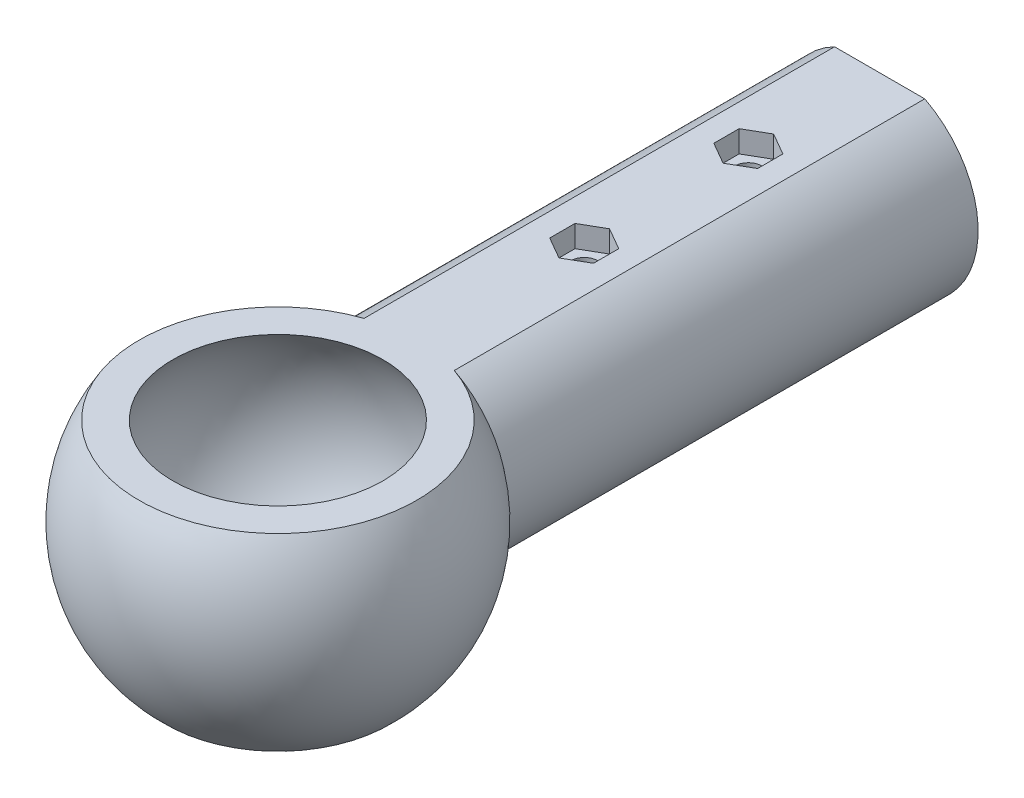
ISO-10303-21;
HEADER;
FILE_DESCRIPTION(('STEP AP214'),'2;1');
FILE_NAME('part.step','',(''),(''),'','','');
FILE_SCHEMA(('AUTOMOTIVE_DESIGN { 1 0 10303 214 1 1 1 1 }'));
ENDSEC;
DATA;
#1=APPLICATION_CONTEXT('core data for automotive mechanical design processes');
#2=APPLICATION_PROTOCOL_DEFINITION('international standard','automotive_design',2000,#1);
#3=PRODUCT_CONTEXT('',#1,'mechanical');
#4=PRODUCT('Part','Part','',(#3));
#5=PRODUCT_RELATED_PRODUCT_CATEGORY('part','',(#4));
#6=PRODUCT_DEFINITION_FORMATION('','',#4);
#7=PRODUCT_DEFINITION_CONTEXT('part definition',#1,'design');
#8=PRODUCT_DEFINITION('design','',#6,#7);
#9=PRODUCT_DEFINITION_SHAPE('','',#8);
#10=(LENGTH_UNIT() NAMED_UNIT(*) SI_UNIT(.MILLI.,.METRE.));
#11=(NAMED_UNIT(*) PLANE_ANGLE_UNIT() SI_UNIT($,.RADIAN.));
#12=(NAMED_UNIT(*) SI_UNIT($,.STERADIAN.) SOLID_ANGLE_UNIT());
#13=UNCERTAINTY_MEASURE_WITH_UNIT(LENGTH_MEASURE(1.E-05),#10,'distance_accuracy_value','');
#14=(GEOMETRIC_REPRESENTATION_CONTEXT(3) GLOBAL_UNCERTAINTY_ASSIGNED_CONTEXT((#13)) GLOBAL_UNIT_ASSIGNED_CONTEXT((#10,
#11,#12)) REPRESENTATION_CONTEXT('',''));
#15=CARTESIAN_POINT('',(0.,0.,0.));
#16=DIRECTION('',(0.,0.,1.));
#17=DIRECTION('',(1.,0.,0.));
#18=AXIS2_PLACEMENT_3D('',#15,#16,#17);
#19=CARTESIAN_POINT('',(0.,0.,0.));
#20=DIRECTION('',(0.,1.,0.));
#21=DIRECTION('',(1.,0.,0.));
#22=AXIS2_PLACEMENT_3D('',#19,#20,#21);
#23=SPHERICAL_SURFACE('',#22,12.5);
#24=CARTESIAN_POINT('',(0.,8.,0.));
#25=DIRECTION('',(0.,1.,0.));
#26=DIRECTION('',(-1.,0.,0.));
#27=AXIS2_PLACEMENT_3D('',#24,#25,#26);
#28=CIRCLE('',#27,9.60468635614927);
#29=CARTESIAN_POINT('',(9.60468635614927,8.,0.));
#30=VERTEX_POINT('',#29);
#31=EDGE_CURVE('E260',#30,#30,#28,.T.);
#32=CARTESIAN_POINT('',(0.,-11.,0.));
#33=DIRECTION('',(0.,1.,0.));
#34=DIRECTION('',(-1.,0.,0.));
#35=AXIS2_PLACEMENT_3D('',#32,#33,#34);
#36=CIRCLE('',#35,5.93717104351896);
#37=CARTESIAN_POINT('',(5.93717104351896,-11.,0.));
#38=VERTEX_POINT('',#37);
#39=EDGE_CURVE('E11',#38,#38,#36,.T.);
#40=CARTESIAN_POINT('',(9.60468635614927,8.,0.));
#41=CARTESIAN_POINT('',(9.75222201246012,7.82288172128415,0.));
#42=CARTESIAN_POINT('',(9.89484713503428,7.6416742013728,0.));
#43=CARTESIAN_POINT('',(10.1698645834093,7.27165351767617,0.));
#44=CARTESIAN_POINT('',(10.3022569092101,7.0828403538909,0.));
#45=CARTESIAN_POINT('',(10.5563970347384,6.69818122096353,0.));
#46=CARTESIAN_POINT('',(10.6781448344659,6.50233525182143,0.));
#47=CARTESIAN_POINT('',(10.910625140093,6.10421110257657,0.));
#48=CARTESIAN_POINT('',(11.0213576459926,5.90193292247381,0.));
#49=CARTESIAN_POINT('',(11.2314680542484,5.49156295696072,0.));
#50=CARTESIAN_POINT('',(11.3308459566047,5.28347117155039,0.));
#51=CARTESIAN_POINT('',(11.5179431948164,4.86211083806857,0.));
#52=CARTESIAN_POINT('',(11.6056625306718,4.64884228999707,0.));
#53=CARTESIAN_POINT('',(11.7691741860143,4.21778099444775,0.));
#54=CARTESIAN_POINT('',(11.8449665055014,3.99998824696993,0.));
#55=CARTESIAN_POINT('',(11.9843922174222,3.56054499177883,0.));
#56=CARTESIAN_POINT('',(12.0480256098561,3.33889448406556,0.));
#57=CARTESIAN_POINT('',(12.1629387509646,2.89241394346969,0.));
#58=CARTESIAN_POINT('',(12.2142184996392,2.66758391058711,0.));
#59=CARTESIAN_POINT('',(12.3042674410165,2.21543228617762,0.));
#60=CARTESIAN_POINT('',(12.3430366337192,1.98811069465072,0.));
#61=CARTESIAN_POINT('',(12.4079458316376,1.53167154287503,0.));
#62=CARTESIAN_POINT('',(12.4340858368533,1.30255398262624,0.));
#63=CARTESIAN_POINT('',(12.4736566730409,0.843223979048433,0.));
#64=CARTESIAN_POINT('',(12.4870875040127,0.613011535719417,0.));
#65=CARTESIAN_POINT('',(12.5011988941851,0.152196201853142,0.));
#66=CARTESIAN_POINT('',(12.5018794533858,-0.0784066886841183,0.));
#67=CARTESIAN_POINT('',(12.4904882175501,-0.539297286338623,0.));
#68=CARTESIAN_POINT('',(12.4784164225138,-0.769584993455867,0.));
#69=CARTESIAN_POINT('',(12.4415574171517,-1.2291405580871,0.));
#70=CARTESIAN_POINT('',(12.4167702068259,-1.45840841560109,0.));
#71=CARTESIAN_POINT('',(12.3545562182204,-1.91522273551862,0.));
#72=CARTESIAN_POINT('',(12.3171294399406,-2.14276919792216,0.));
#73=CARTESIAN_POINT('',(12.2297508390607,-2.5954444494747,0.));
#74=CARTESIAN_POINT('',(12.1797990164606,-2.8205732386237,0.));
#75=CARTESIAN_POINT('',(12.0675231764372,-3.26772426345419,0.));
#76=CARTESIAN_POINT('',(12.0051991590138,-3.48974649913568,0.));
#77=CARTESIAN_POINT('',(11.8683696369941,-3.93000504267989,0.));
#78=CARTESIAN_POINT('',(11.7938641323978,-4.14824135054262,0.));
#79=CARTESIAN_POINT('',(11.6328996182825,-4.58026024880499,0.));
#80=CARTESIAN_POINT('',(11.5464406087636,-4.79404283920462,0.));
#81=CARTESIAN_POINT('',(11.3618336440391,-5.21650014099272,0.));
#82=CARTESIAN_POINT('',(11.2636856888334,-5.42517485238118,0.));
#83=CARTESIAN_POINT('',(11.0560011594345,-5.83677786441066,0.));
#84=CARTESIAN_POINT('',(10.9464645852413,-6.03970616505168,0.));
#85=CARTESIAN_POINT('',(10.7163379929995,-6.43919540744912,0.));
#86=CARTESIAN_POINT('',(10.5957479749509,-6.63575634920555,0.));
#87=CARTESIAN_POINT('',(10.3438834931323,-7.02190940965899,0.));
#88=CARTESIAN_POINT('',(10.2126090293623,-7.21150152835601,0.));
#89=CARTESIAN_POINT('',(9.93977734743803,-7.58313680180104,0.));
#90=CARTESIAN_POINT('',(9.79822012928373,-7.76517995654905,0.));
#91=CARTESIAN_POINT('',(9.50525609654527,-8.12116026386845,0.));
#92=CARTESIAN_POINT('',(9.35384928196111,-8.29509741643983,0.));
#93=CARTESIAN_POINT('',(9.04164934592502,-8.63433347273774,0.));
#94=CARTESIAN_POINT('',(8.88085622447309,-8.79963237646427,0.));
#95=CARTESIAN_POINT('',(8.55037571396118,-9.12108616684501,0.));
#96=CARTESIAN_POINT('',(8.3806883249012,-9.27724105349922,0.));
#97=CARTESIAN_POINT('',(8.03293842918388,-9.57992885021599,0.));
#98=CARTESIAN_POINT('',(7.85487592252655,-9.72646176027855,0.));
#99=CARTESIAN_POINT('',(7.49092096142917,-10.0094577266968,0.));
#100=CARTESIAN_POINT('',(7.30502850698913,-10.1459207830526,0.));
#101=CARTESIAN_POINT('',(6.92598131461576,-10.4083575904974,0.));
#102=CARTESIAN_POINT('',(6.73282657668245,-10.5343313415866,0.));
#103=CARTESIAN_POINT('',(6.3398501700216,-10.7754110941207,0.));
#104=CARTESIAN_POINT('',(6.14002850129407,-10.8905170955658,0.));
#105=CARTESIAN_POINT('',(5.93717104351896,-11.,0.));
#106=B_SPLINE_CURVE_WITH_KNOTS('',3,(#40,#41,#42,#43,#44,#45,#46,#47,#48,#49,#50,#51,#52,#53,
#54,#55,#56,#57,#58,#59,#60,#61,#62,#63,#64,#65,#66,#67,#68,#69,#70,#71,#72,#73,#74,#75,#76,#77,
#78,#79,#80,#81,#82,#83,#84,#85,#86,#87,#88,#89,#90,#91,#92,#93,#94,#95,#96,#97,#98,#99,#100,
#101,#102,#103,#104,#105),.UNSPECIFIED.,.F.,.F.,(4,2,2,2,2,2,2,2,2,2,2,2,2,2,2,2,2,2,2,2,2,2,2,
2,2,2,2,2,2,2,2,2,4),(0.,0.691458867471599,1.3829177349432,2.0743766024148,2.7658354698864,
3.457294337358,4.1487532048296,4.84021207230119,5.53167093977279,6.22312980724439,
6.91458867471599,7.60604754218759,8.29750640965919,8.98896527713079,9.68042414460239,
10.371883012074,11.0633418795456,11.7548007470172,12.4462596144888,13.1377184819604,
13.829177349432,14.5206362169036,15.2120950843752,15.9035539518468,16.5950128193184,
17.28647168679,17.9779305542616,18.6693894217332,19.3608482892048,20.0523071566764,
20.743766024148,21.4352248916196,22.1266837590912),.UNSPECIFIED.);
#107=EDGE_CURVE('BSEAM38',#30,#38,#106,.T.);
#108=ORIENTED_EDGE('',*,*,#31,.T.);
#109=ORIENTED_EDGE('',*,*,#39,.F.);
#110=ORIENTED_EDGE('',*,*,#107,.T.);
#111=ORIENTED_EDGE('',*,*,#107,.F.);
#112=EDGE_LOOP('',(#108,#110,#109,#111));
#113=FACE_BOUND('',#112,.T.);
#114=ADVANCED_FACE('F38',(#113),#23,.F.);
#115=CARTESIAN_POINT('',(0.,-11.,0.));
#116=DIRECTION('',(0.,1.,0.));
#117=DIRECTION('',(-1.,0.,0.));
#118=AXIS2_PLACEMENT_3D('',#115,#116,#117);
#119=PLANE('',#118);
#120=CARTESIAN_POINT('',(0.,-11.,0.));
#121=DIRECTION('',(0.,1.,0.));
#122=DIRECTION('',(-1.,0.,0.));
#123=AXIS2_PLACEMENT_3D('',#120,#121,#122);
#124=CIRCLE('',#123,10.1980390271856);
#125=CARTESIAN_POINT('',(-10.1980390271856,-11.,0.));
#126=VERTEX_POINT('',#125);
#127=EDGE_CURVE('E45',#126,#126,#124,.T.);
#128=ORIENTED_EDGE('',*,*,#127,.F.);
#129=EDGE_LOOP('',(#128));
#130=FACE_BOUND('',#129,.T.);
#131=ORIENTED_EDGE('',*,*,#39,.T.);
#132=EDGE_LOOP('',(#131));
#133=FACE_BOUND('',#132,.T.);
#134=ADVANCED_FACE('F271',(#130,#133),#119,.F.);
#135=CARTESIAN_POINT('',(0.,0.,0.));
#136=DIRECTION('',(0.,1.,0.));
#137=DIRECTION('',(1.,0.,0.));
#138=AXIS2_PLACEMENT_3D('',#135,#136,#137);
#139=SPHERICAL_SURFACE('',#138,15.);
#140=CARTESIAN_POINT('',(0.,8.,0.));
#141=DIRECTION('',(0.,1.,0.));
#142=DIRECTION('',(-1.,0.,0.));
#143=AXIS2_PLACEMENT_3D('',#140,#141,#142);
#144=CIRCLE('',#143,12.6885775404495);
#145=CARTESIAN_POINT('',(-4.12310562561766,8.,-12.));
#146=VERTEX_POINT('',#145);
#147=CARTESIAN_POINT('',(4.12310562561766,8.,-12.));
#148=VERTEX_POINT('',#147);
#149=EDGE_CURVE('E264',#146,#148,#144,.T.);
#150=ORIENTED_EDGE('',*,*,#149,.F.);
#151=CARTESIAN_POINT('',(0.,0.,-12.));
#152=DIRECTION('',(0.,0.,1.));
#153=DIRECTION('',(1.,0.,0.));
#154=AXIS2_PLACEMENT_3D('',#151,#152,#153);
#155=CIRCLE('',#154,9.);
#156=EDGE_CURVE('E254',#148,#146,#155,.F.);
#157=ORIENTED_EDGE('',*,*,#156,.F.);
#158=EDGE_LOOP('',(#150,#157));
#159=FACE_BOUND('',#158,.T.);
#160=ORIENTED_EDGE('',*,*,#127,.T.);
#161=EDGE_LOOP('',(#160));
#162=FACE_BOUND('',#161,.T.);
#163=ADVANCED_FACE('F269',(#159,#162),#139,.T.);
#164=CARTESIAN_POINT('',(0.,8.,0.));
#165=DIRECTION('',(0.,1.,0.));
#166=DIRECTION('',(-1.,0.,0.));
#167=AXIS2_PLACEMENT_3D('',#164,#165,#166);
#168=PLANE('',#167);
#169=DIRECTION('',(0.866025403784438,0.,0.500000000000002));
#170=VECTOR('',#169,1.);
#171=CARTESIAN_POINT('',(11.1243556529822,8.,-19.2679491924311));
#172=LINE('',#171,#170);
#173=CARTESIAN_POINT('',(-2.,8.,-26.8452994616208));
#174=VERTEX_POINT('',#173);
#175=CARTESIAN_POINT('',(0.,8.,-25.6905989232415));
#176=VERTEX_POINT('',#175);
#177=EDGE_CURVE('E52',#174,#176,#172,.T.);
#178=ORIENTED_EDGE('',*,*,#177,.F.);
#179=DIRECTION('',(0.,0.,1.));
#180=VECTOR('',#179,1.);
#181=CARTESIAN_POINT('',(-2.00000000000003,8.,0.));
#182=LINE('',#181,#180);
#183=CARTESIAN_POINT('',(-2.,8.,-29.1547005383792));
#184=VERTEX_POINT('',#183);
#185=EDGE_CURVE('E159',#184,#174,#182,.T.);
#186=ORIENTED_EDGE('',*,*,#185,.F.);
#187=DIRECTION('',(-0.866025403784439,0.,0.499999999999999));
#188=VECTOR('',#187,1.);
#189=CARTESIAN_POINT('',(-13.1243556529821,8.,-22.7320508075689));
#190=LINE('',#189,#188);
#191=CARTESIAN_POINT('',(0.,8.,-30.3094010767585));
#192=VERTEX_POINT('',#191);
#193=EDGE_CURVE('E162',#192,#184,#190,.T.);
#194=ORIENTED_EDGE('',*,*,#193,.F.);
#195=DIRECTION('',(-0.866025403784438,0.,-0.500000000000001));
#196=VECTOR('',#195,1.);
#197=CARTESIAN_POINT('',(13.1243556529822,8.,-22.7320508075688));
#198=LINE('',#197,#196);
#199=CARTESIAN_POINT('',(2.,8.,-29.1547005383792));
#200=VERTEX_POINT('',#199);
#201=EDGE_CURVE('E182',#200,#192,#198,.T.);
#202=ORIENTED_EDGE('',*,*,#201,.F.);
#203=DIRECTION('',(0.,0.,-1.));
#204=VECTOR('',#203,1.);
#205=CARTESIAN_POINT('',(1.99999999999997,8.,0.));
#206=LINE('',#205,#204);
#207=CARTESIAN_POINT('',(2.,8.,-26.8452994616207));
#208=VERTEX_POINT('',#207);
#209=EDGE_CURVE('E179',#208,#200,#206,.T.);
#210=ORIENTED_EDGE('',*,*,#209,.F.);
#211=DIRECTION('',(0.866025403784439,0.,-0.499999999999999));
#212=VECTOR('',#211,1.);
#213=CARTESIAN_POINT('',(-11.1243556529821,8.,-19.2679491924311));
#214=LINE('',#213,#212);
#215=EDGE_CURVE('E176',#176,#208,#214,.T.);
#216=ORIENTED_EDGE('',*,*,#215,.F.);
#217=EDGE_LOOP('',(#178,#186,#194,#202,#210,#216));
#218=FACE_BOUND('',#217,.T.);
#219=DIRECTION('',(0.866025403784437,0.,0.500000000000004));
#220=VECTOR('',#219,1.);
#221=CARTESIAN_POINT('',(17.6195461813655,8.,-30.517949192431));
#222=LINE('',#221,#220);
#223=CARTESIAN_POINT('',(-2.00000000000001,8.,-41.8452994616207));
#224=VERTEX_POINT('',#223);
#225=CARTESIAN_POINT('',(0.,8.,-40.6905989232415));
#226=VERTEX_POINT('',#225);
#227=EDGE_CURVE('E60',#224,#226,#222,.T.);
#228=ORIENTED_EDGE('',*,*,#227,.F.);
#229=DIRECTION('',(0.,0.,1.));
#230=VECTOR('',#229,1.);
#231=CARTESIAN_POINT('',(-2.00000000000016,8.,0.));
#232=LINE('',#231,#230);
#233=CARTESIAN_POINT('',(-2.00000000000001,8.,-44.1547005383793));
#234=VERTEX_POINT('',#233);
#235=EDGE_CURVE('E201',#234,#224,#232,.T.);
#236=ORIENTED_EDGE('',*,*,#235,.F.);
#237=DIRECTION('',(-0.866025403784442,0.,0.499999999999995));
#238=VECTOR('',#237,1.);
#239=CARTESIAN_POINT('',(-19.6195461813653,8.,-33.9820508075691));
#240=LINE('',#239,#238);
#241=CARTESIAN_POINT('',(0.,8.,-45.3094010767585));
#242=VERTEX_POINT('',#241);
#243=EDGE_CURVE('E228',#242,#234,#240,.T.);
#244=ORIENTED_EDGE('',*,*,#243,.F.);
#245=DIRECTION('',(-0.866025403784438,0.,-0.500000000000001));
#246=VECTOR('',#245,1.);
#247=CARTESIAN_POINT('',(19.6195461813655,8.,-33.9820508075688));
#248=LINE('',#247,#246);
#249=CARTESIAN_POINT('',(1.99999999999999,8.,-44.1547005383792));
#250=VERTEX_POINT('',#249);
#251=EDGE_CURVE('E225',#250,#242,#248,.T.);
#252=ORIENTED_EDGE('',*,*,#251,.F.);
#253=DIRECTION('',(0.,0.,-1.));
#254=VECTOR('',#253,1.);
#255=CARTESIAN_POINT('',(1.99999999999985,8.,0.));
#256=LINE('',#255,#254);
#257=CARTESIAN_POINT('',(1.99999999999999,8.,-41.8452994616207));
#258=VERTEX_POINT('',#257);
#259=EDGE_CURVE('E222',#258,#250,#256,.T.);
#260=ORIENTED_EDGE('',*,*,#259,.F.);
#261=DIRECTION('',(0.86602540378444,0.,-0.499999999999997));
#262=VECTOR('',#261,1.);
#263=CARTESIAN_POINT('',(-17.6195461813654,8.,-30.5179491924313));
#264=LINE('',#263,#262);
#265=EDGE_CURVE('E218',#226,#258,#264,.T.);
#266=ORIENTED_EDGE('',*,*,#265,.F.);
#267=EDGE_LOOP('',(#228,#236,#244,#252,#260,#266));
#268=FACE_BOUND('',#267,.T.);
#269=ORIENTED_EDGE('',*,*,#149,.T.);
#270=DIRECTION('',(0.,0.,-1.));
#271=VECTOR('',#270,1.);
#272=CARTESIAN_POINT('',(4.12310562561766,8.,15.002));
#273=LINE('',#272,#271);
#274=CARTESIAN_POINT('',(4.12310562561766,8.,-55.));
#275=VERTEX_POINT('',#274);
#276=EDGE_CURVE('E257',#148,#275,#273,.T.);
#277=ORIENTED_EDGE('',*,*,#276,.T.);
#278=DIRECTION('',(1.,0.,0.));
#279=VECTOR('',#278,1.);
#280=CARTESIAN_POINT('',(0.,8.,-55.));
#281=LINE('',#280,#279);
#282=CARTESIAN_POINT('',(-4.12310562561766,8.,-55.));
#283=VERTEX_POINT('',#282);
#284=EDGE_CURVE('E246',#283,#275,#281,.T.);
#285=ORIENTED_EDGE('',*,*,#284,.F.);
#286=DIRECTION('',(0.,0.,-1.));
#287=VECTOR('',#286,1.);
#288=CARTESIAN_POINT('',(-4.12310562561766,8.,15.002));
#289=LINE('',#288,#287);
#290=EDGE_CURVE('E258',#146,#283,#289,.T.);
#291=ORIENTED_EDGE('',*,*,#290,.F.);
#292=EDGE_LOOP('',(#269,#277,#285,#291));
#293=FACE_BOUND('',#292,.T.);
#294=ORIENTED_EDGE('',*,*,#31,.F.);
#295=EDGE_LOOP('',(#294));
#296=FACE_BOUND('',#295,.T.);
#297=ADVANCED_FACE('F282',(#218,#268,#293,#296),#168,.T.);
#298=CARTESIAN_POINT('',(0.,0.,15.002));
#299=DIRECTION('',(0.,0.,-1.));
#300=DIRECTION('',(-1.,0.,0.));
#301=AXIS2_PLACEMENT_3D('',#298,#299,#300);
#302=CYLINDRICAL_SURFACE('',#301,9.);
#303=ORIENTED_EDGE('',*,*,#276,.F.);
#304=ORIENTED_EDGE('',*,*,#156,.T.);
#305=ORIENTED_EDGE('',*,*,#290,.T.);
#306=CARTESIAN_POINT('',(0.,0.,-55.));
#307=DIRECTION('',(0.,0.,-1.));
#308=DIRECTION('',(-1.,0.,0.));
#309=AXIS2_PLACEMENT_3D('',#306,#307,#308);
#310=CIRCLE('',#309,9.);
#311=EDGE_CURVE('E251',#275,#283,#310,.T.);
#312=ORIENTED_EDGE('',*,*,#311,.F.);
#313=EDGE_LOOP('',(#303,#304,#305,#312));
#314=FACE_BOUND('',#313,.T.);
#315=ADVANCED_FACE('F284',(#314),#302,.T.);
#316=CARTESIAN_POINT('',(0.,0.,-55.));
#317=DIRECTION('',(0.,0.,-1.));
#318=DIRECTION('',(-1.,0.,0.));
#319=AXIS2_PLACEMENT_3D('',#316,#317,#318);
#320=PLANE('',#319);
#321=CARTESIAN_POINT('',(0.,0.,-55.));
#322=DIRECTION('',(0.,0.,-1.));
#323=DIRECTION('',(-1.,0.,0.));
#324=AXIS2_PLACEMENT_3D('',#321,#322,#323);
#325=CIRCLE('',#324,3.25);
#326=CARTESIAN_POINT('',(-3.25,0.,-55.));
#327=VERTEX_POINT('',#326);
#328=EDGE_CURVE('E189',#327,#327,#325,.T.);
#329=ORIENTED_EDGE('',*,*,#328,.F.);
#330=EDGE_LOOP('',(#329));
#331=FACE_BOUND('',#330,.T.);
#332=ORIENTED_EDGE('',*,*,#284,.T.);
#333=ORIENTED_EDGE('',*,*,#311,.T.);
#334=EDGE_LOOP('',(#332,#333));
#335=FACE_BOUND('',#334,.T.);
#336=ADVANCED_FACE('F291',(#331,#335),#320,.T.);
#337=CARTESIAN_POINT('',(0.,0.,-20.));
#338=DIRECTION('',(0.,0.,-1.));
#339=DIRECTION('',(-1.,0.,0.));
#340=AXIS2_PLACEMENT_3D('',#337,#338,#339);
#341=CYLINDRICAL_SURFACE('',#340,3.25);
#342=CARTESIAN_POINT('',(-1.25,3.,-28.));
#343=CARTESIAN_POINT('',(-1.25000319745537,2.99999693020502,-28.0673619037019));
#344=CARTESIAN_POINT('',(-1.24453685637931,3.00229337273143,-28.134703414101));
#345=CARTESIAN_POINT('',(-1.22292233273156,3.01116197062263,-28.2673477646486));
#346=CARTESIAN_POINT('',(-1.2067748865064,3.01773383124313,-28.3326507450068));
#347=CARTESIAN_POINT('',(-1.1644851118749,3.03430103760264,-28.4592621475164));
#348=CARTESIAN_POINT('',(-1.1383678573194,3.04428778845201,-28.5205801427222));
#349=CARTESIAN_POINT('',(-1.07696928444334,3.0665453255829,-28.6379885216928));
#350=CARTESIAN_POINT('',(-1.04168506808282,3.07881683381849,-28.6940772446437));
#351=CARTESIAN_POINT('',(-0.960976296274042,3.10498062183253,-28.8023709830085));
#352=CARTESIAN_POINT('',(-0.915148937781949,3.11892225061194,-28.8542639572216));
#353=CARTESIAN_POINT('',(-0.815508173640209,3.14644493430797,-28.9498496653749));
#354=CARTESIAN_POINT('',(-0.761692953494643,3.16002590647052,-28.9935405310312));
#355=CARTESIAN_POINT('',(-0.645213952737278,3.18588750336085,-29.0730070697435));
#356=CARTESIAN_POINT('',(-0.582301074228336,3.19810357973386,-29.1084405175847));
#357=CARTESIAN_POINT('',(-0.450853922361868,3.2192627617563,-29.1680899032031));
#358=CARTESIAN_POINT('',(-0.382321718911632,3.22820706600862,-29.1923099498384));
#359=CARTESIAN_POINT('',(-0.244863970836962,3.24146435676523,-29.2277414672968));
#360=CARTESIAN_POINT('',(-0.176095842151855,3.24596818629773,-29.2394908235221));
#361=CARTESIAN_POINT('',(-0.0374262679004803,3.25052381421997,-29.2513741489623));
#362=CARTESIAN_POINT('',(0.032474781784929,3.2505771355938,-29.2515120916558));
#363=CARTESIAN_POINT('',(0.167558378646777,3.24634513674766,-29.2404749553469));
#364=CARTESIAN_POINT('',(0.232797273028927,3.2422852859325,-29.229887791487));
#365=CARTESIAN_POINT('',(0.360490142606252,3.23058193371427,-29.1986941080258));
#366=CARTESIAN_POINT('',(0.422943919236668,3.22293817724281,-29.1780868752871));
#367=CARTESIAN_POINT('',(0.544392795335088,3.20467884617932,-29.1271811489929));
#368=CARTESIAN_POINT('',(0.603323110386444,3.19402100637039,-29.0967438821445));
#369=CARTESIAN_POINT('',(0.715388559935737,3.17080417065107,-29.0271674937718));
#370=CARTESIAN_POINT('',(0.768521766140895,3.15824454544671,-28.9880254898642));
#371=CARTESIAN_POINT('',(0.870936405392396,3.13160338306432,-28.8993517955799));
#372=CARTESIAN_POINT('',(0.919782699079309,3.11747574681477,-28.8493306423069));
#373=CARTESIAN_POINT('',(1.00856291638196,3.08989754555098,-28.741732897635));
#374=CARTESIAN_POINT('',(1.04849435624595,3.07644717003351,-28.6841542077216));
#375=CARTESIAN_POINT('',(1.11920339124959,3.05144704670473,-28.5612731298965));
#376=CARTESIAN_POINT('',(1.14973383655413,3.03995168719358,-28.4958165538704));
#377=CARTESIAN_POINT('',(1.19917065122021,3.02079477808357,-28.3601318766066));
#378=CARTESIAN_POINT('',(1.21808389456943,3.01313096183162,-28.2899066244055));
#379=CARTESIAN_POINT('',(1.24273369497321,3.00304533622891,-28.1509948901989));
#380=CARTESIAN_POINT('',(1.24916509228454,3.0003475638472,-28.0824519404939));
#381=CARTESIAN_POINT('',(1.25068166613256,2.99971628443752,-27.9452281248645));
#382=CARTESIAN_POINT('',(1.24576989591137,3.00178149535642,-27.8765473010237));
#383=CARTESIAN_POINT('',(1.22537063478902,3.01016207538222,-27.7446701945395));
#384=CARTESIAN_POINT('',(1.21043489510388,3.01625547027882,-27.6813727861931));
#385=CARTESIAN_POINT('',(1.17111398546468,3.03173799310363,-27.5582161865435));
#386=CARTESIAN_POINT('',(1.14672681901346,3.04112781732231,-27.498357724745));
#387=CARTESIAN_POINT('',(1.08813611829483,3.06259143766587,-27.3811986491843));
#388=CARTESIAN_POINT('',(1.05358913575224,3.07475506002144,-27.324086745449));
#389=CARTESIAN_POINT('',(0.976019360175656,3.1002501506241,-27.2162251523608));
#390=CARTESIAN_POINT('',(0.932993328547017,3.11358206401908,-27.165477906163));
#391=CARTESIAN_POINT('',(0.83626325958636,3.14099555684997,-27.0682404625906));
#392=CARTESIAN_POINT('',(0.782035458961136,3.15506720238119,-27.0222666382929));
#393=CARTESIAN_POINT('',(0.666292421085889,3.1815207084538,-26.940002674918));
#394=CARTESIAN_POINT('',(0.604777064768513,3.19390254137915,-26.9037126940913));
#395=CARTESIAN_POINT('',(0.476154665885962,3.21558937621932,-26.842049821881));
#396=CARTESIAN_POINT('',(0.409061117020675,3.22490154724727,-26.8166514510455));
#397=CARTESIAN_POINT('',(0.271111383060865,3.23941321779922,-26.7776541843055));
#398=CARTESIAN_POINT('',(0.200257088685054,3.24461476343106,-26.7640494176807));
#399=CARTESIAN_POINT('',(0.0614523625310875,3.25011592293021,-26.7496828754415));
#400=CARTESIAN_POINT('',(-0.0064118458628447,3.25069498408108,-26.7481888657312));
#401=CARTESIAN_POINT('',(-0.141385544694169,3.24762448574428,-26.7561837719125));
#402=CARTESIAN_POINT('',(-0.208495133147152,3.24397548198717,-26.7656712444142));
#403=CARTESIAN_POINT('',(-0.338226792363145,3.23299123990487,-26.7948414710953));
#404=CARTESIAN_POINT('',(-0.400920852452223,3.22575708710739,-26.8142450775223));
#405=CARTESIAN_POINT('',(-0.52216264283521,3.20836420973963,-26.8624131779957));
#406=CARTESIAN_POINT('',(-0.580709585477494,3.19820493145345,-26.8911794444952));
#407=CARTESIAN_POINT('',(-0.694753814378629,3.17542819862808,-26.9586575559447));
#408=CARTESIAN_POINT('',(-0.750012005524315,3.16272388454766,-26.9977436006713));
#409=CARTESIAN_POINT('',(-0.853407182927476,3.13640676260279,-27.0841722227112));
#410=CARTESIAN_POINT('',(-0.901541566866075,3.1227936253684,-27.1315178035313));
#411=CARTESIAN_POINT('',(-0.992113372825141,3.09525091761236,-27.2362796905163));
#412=CARTESIAN_POINT('',(-1.034078782729,3.08134653941818,-27.2941123534207));
#413=CARTESIAN_POINT('',(-1.10772808741657,3.05564485192131,-27.4164446151574));
#414=CARTESIAN_POINT('',(-1.13940985712348,3.04384797835295,-27.4809455883455));
#415=CARTESIAN_POINT('',(-1.19311045220384,3.02322328375289,-27.6194040308052));
#416=CARTESIAN_POINT('',(-1.2143502399674,3.01464387894162,-27.6937048819332));
#417=CARTESIAN_POINT('',(-1.24278782694803,3.00303611439598,-27.8453476859382));
#418=CARTESIAN_POINT('',(-1.24999633021077,3.00000352327062,-27.9226872746645));
#419=CARTESIAN_POINT('',(-1.25,3.,-28.));
#420=B_SPLINE_CURVE_WITH_KNOTS('',3,(#342,#343,#344,#345,#346,#347,#348,#349,#350,#351,#352,
#353,#354,#355,#356,#357,#358,#359,#360,#361,#362,#363,#364,#365,#366,#367,#368,#369,#370,#371,
#372,#373,#374,#375,#376,#377,#378,#379,#380,#381,#382,#383,#384,#385,#386,#387,#388,#389,#390,
#391,#392,#393,#394,#395,#396,#397,#398,#399,#400,#401,#402,#403,#404,#405,#406,#407,#408,#409,
#410,#411,#412,#413,#414,#415,#416,#417,#418,#419),.UNSPECIFIED.,.T.,.F.,(4,2,2,2,2,2,2,2,2,2,2,
2,2,2,2,2,2,2,2,2,2,2,2,2,2,2,2,2,2,2,2,2,2,2,2,2,2,2,4),(0.,0.201797444211816,
0.403580978125017,0.604860339111082,0.806203410075655,1.01713244424793,1.22810946588885,
1.44669414936216,1.66519867467047,1.87383930943269,2.08240854612957,2.28013197925201,
2.4778694865884,2.67853038326393,2.87925782359888,3.09227760525095,3.30535666211038,
3.52363527865721,3.74178461333498,3.94739605770352,4.15295216405936,4.34803207327522,
4.54315321319247,4.74582749170857,4.94857933275212,5.1649768242965,5.3813778519279,
5.59726983969923,5.81305429711433,6.01568680422644,6.21829268064435,6.41548575788379,
6.61271618764294,6.81842036614766,7.02419950366363,7.24153996942644,7.45892531925475,
7.69070953568987,7.92231686149795),.UNSPECIFIED.);
#421=CARTESIAN_POINT('',(-1.25,3.,-28.));
#422=VERTEX_POINT('',#421);
#423=EDGE_CURVE('E219',#422,#422,#420,.T.);
#424=ORIENTED_EDGE('',*,*,#423,.F.);
#425=EDGE_LOOP('',(#424));
#426=FACE_BOUND('',#425,.T.);
#427=CARTESIAN_POINT('',(-1.25,3.,-43.));
#428=CARTESIAN_POINT('',(-1.25000319745537,2.99999693020502,-43.0673619037019));
#429=CARTESIAN_POINT('',(-1.24453685637931,3.00229337273143,-43.134703414101));
#430=CARTESIAN_POINT('',(-1.22292233273156,3.01116197062263,-43.2673477646486));
#431=CARTESIAN_POINT('',(-1.2067748865064,3.01773383124313,-43.3326507450068));
#432=CARTESIAN_POINT('',(-1.1644851118749,3.03430103760264,-43.4592621475163));
#433=CARTESIAN_POINT('',(-1.13836785731941,3.04428778845201,-43.5205801427222));
#434=CARTESIAN_POINT('',(-1.07696928444334,3.0665453255829,-43.6379885216928));
#435=CARTESIAN_POINT('',(-1.04168506808282,3.07881683381849,-43.6940772446437));
#436=CARTESIAN_POINT('',(-0.960976296274045,3.10498062183253,-43.8023709830084));
#437=CARTESIAN_POINT('',(-0.915148937781953,3.11892225061194,-43.8542639572216));
#438=CARTESIAN_POINT('',(-0.815508173640213,3.14644493430797,-43.9498496653749));
#439=CARTESIAN_POINT('',(-0.761692953494646,3.16002590647052,-43.9935405310312));
#440=CARTESIAN_POINT('',(-0.645213952737282,3.18588750336085,-44.0730070697435));
#441=CARTESIAN_POINT('',(-0.582301074228343,3.19810357973386,-44.1084405175847));
#442=CARTESIAN_POINT('',(-0.450853922361876,3.2192627617563,-44.1680899032031));
#443=CARTESIAN_POINT('',(-0.382321718911638,3.22820706600862,-44.1923099498384));
#444=CARTESIAN_POINT('',(-0.244863970836967,3.24146435676523,-44.2277414672968));
#445=CARTESIAN_POINT('',(-0.17609584215186,3.24596818629773,-44.2394908235221));
#446=CARTESIAN_POINT('',(-0.0374262679004836,3.25052381421997,-44.2513741489623));
#447=CARTESIAN_POINT('',(0.0324747817849268,3.2505771355938,-44.2515120916558));
#448=CARTESIAN_POINT('',(0.167558378646775,3.24634513674766,-44.2404749553469));
#449=CARTESIAN_POINT('',(0.232797273028924,3.2422852859325,-44.229887791487));
#450=CARTESIAN_POINT('',(0.360490142606249,3.23058193371427,-44.1986941080258));
#451=CARTESIAN_POINT('',(0.422943919236665,3.22293817724281,-44.1780868752871));
#452=CARTESIAN_POINT('',(0.544392795335086,3.20467884617932,-44.1271811489929));
#453=CARTESIAN_POINT('',(0.603323110386442,3.19402100637039,-44.0967438821445));
#454=CARTESIAN_POINT('',(0.715388559935735,3.17080417065107,-44.0271674937718));
#455=CARTESIAN_POINT('',(0.768521766140892,3.15824454544671,-43.9880254898642));
#456=CARTESIAN_POINT('',(0.870936405392393,3.13160338306432,-43.8993517955799));
#457=CARTESIAN_POINT('',(0.919782699079306,3.11747574681477,-43.8493306423069));
#458=CARTESIAN_POINT('',(1.00856291638196,3.08989754555098,-43.7417328976351));
#459=CARTESIAN_POINT('',(1.04849435624594,3.07644717003351,-43.6841542077216));
#460=CARTESIAN_POINT('',(1.11920339124959,3.05144704670473,-43.5612731298965));
#461=CARTESIAN_POINT('',(1.14973383655413,3.03995168719358,-43.4958165538704));
#462=CARTESIAN_POINT('',(1.19917065122021,3.02079477808357,-43.3601318766066));
#463=CARTESIAN_POINT('',(1.21808389456943,3.01313096183162,-43.2899066244055));
#464=CARTESIAN_POINT('',(1.24273369497321,3.00304533622891,-43.1509948901989));
#465=CARTESIAN_POINT('',(1.24916509228454,3.0003475638472,-43.0824519404939));
#466=CARTESIAN_POINT('',(1.25068166613256,2.99971628443752,-42.9452281248645));
#467=CARTESIAN_POINT('',(1.24576989591137,3.00178149535642,-42.8765473010237));
#468=CARTESIAN_POINT('',(1.22537063478903,3.01016207538222,-42.7446701945395));
#469=CARTESIAN_POINT('',(1.21043489510388,3.01625547027882,-42.6813727861931));
#470=CARTESIAN_POINT('',(1.17111398546468,3.03173799310363,-42.5582161865435));
#471=CARTESIAN_POINT('',(1.14672681901346,3.04112781732231,-42.498357724745));
#472=CARTESIAN_POINT('',(1.08813611829483,3.06259143766587,-42.3811986491843));
#473=CARTESIAN_POINT('',(1.05358913575225,3.07475506002144,-42.324086745449));
#474=CARTESIAN_POINT('',(0.976019360175659,3.1002501506241,-42.2162251523608));
#475=CARTESIAN_POINT('',(0.932993328547018,3.11358206401908,-42.165477906163));
#476=CARTESIAN_POINT('',(0.836263259586361,3.14099555684997,-42.0682404625906));
#477=CARTESIAN_POINT('',(0.782035458961138,3.15506720238119,-42.0222666382929));
#478=CARTESIAN_POINT('',(0.666292421085894,3.1815207084538,-41.940002674918));
#479=CARTESIAN_POINT('',(0.60477706476852,3.19390254137915,-41.9037126940913));
#480=CARTESIAN_POINT('',(0.476154665885971,3.21558937621932,-41.8420498218809));
#481=CARTESIAN_POINT('',(0.409061117020684,3.22490154724727,-41.8166514510455));
#482=CARTESIAN_POINT('',(0.271111383060872,3.23941321779922,-41.7776541843055));
#483=CARTESIAN_POINT('',(0.200257088685059,3.24461476343106,-41.7640494176807));
#484=CARTESIAN_POINT('',(0.0614523625310912,3.25011592293021,-41.7496828754415));
#485=CARTESIAN_POINT('',(-0.00641184586284085,3.25069498408108,-41.7481888657312));
#486=CARTESIAN_POINT('',(-0.141385544694165,3.24762448574428,-41.7561837719125));
#487=CARTESIAN_POINT('',(-0.208495133147149,3.24397548198717,-41.7656712444142));
#488=CARTESIAN_POINT('',(-0.338226792363142,3.23299123990487,-41.7948414710953));
#489=CARTESIAN_POINT('',(-0.400920852452219,3.22575708710739,-41.8142450775223));
#490=CARTESIAN_POINT('',(-0.522162642835207,3.20836420973963,-41.8624131779957));
#491=CARTESIAN_POINT('',(-0.58070958547749,3.19820493145345,-41.8911794444952));
#492=CARTESIAN_POINT('',(-0.694753814378626,3.17542819862808,-41.9586575559447));
#493=CARTESIAN_POINT('',(-0.75001200552431,3.16272388454766,-41.9977436006713));
#494=CARTESIAN_POINT('',(-0.85340718292747,3.1364067626028,-42.0841722227112));
#495=CARTESIAN_POINT('',(-0.90154156686607,3.1227936253684,-42.1315178035313));
#496=CARTESIAN_POINT('',(-0.992113372825138,3.09525091761236,-42.2362796905162));
#497=CARTESIAN_POINT('',(-1.034078782729,3.08134653941819,-42.2941123534207));
#498=CARTESIAN_POINT('',(-1.10772808741657,3.05564485192131,-42.4164446151574));
#499=CARTESIAN_POINT('',(-1.13940985712348,3.04384797835295,-42.4809455883455));
#500=CARTESIAN_POINT('',(-1.19311045220384,3.02322328375289,-42.6194040308052));
#501=CARTESIAN_POINT('',(-1.2143502399674,3.01464387894162,-42.6937048819332));
#502=CARTESIAN_POINT('',(-1.24278782694803,3.00303611439598,-42.8453476859382));
#503=CARTESIAN_POINT('',(-1.24999633021077,3.00000352327062,-42.9226872746645));
#504=CARTESIAN_POINT('',(-1.25,3.,-43.));
#505=B_SPLINE_CURVE_WITH_KNOTS('',3,(#427,#428,#429,#430,#431,#432,#433,#434,#435,#436,#437,
#438,#439,#440,#441,#442,#443,#444,#445,#446,#447,#448,#449,#450,#451,#452,#453,#454,#455,#456,
#457,#458,#459,#460,#461,#462,#463,#464,#465,#466,#467,#468,#469,#470,#471,#472,#473,#474,#475,
#476,#477,#478,#479,#480,#481,#482,#483,#484,#485,#486,#487,#488,#489,#490,#491,#492,#493,#494,
#495,#496,#497,#498,#499,#500,#501,#502,#503,#504),.UNSPECIFIED.,.T.,.F.,(4,2,2,2,2,2,2,2,2,2,2,
2,2,2,2,2,2,2,2,2,2,2,2,2,2,2,2,2,2,2,2,2,2,2,2,2,2,2,4),(0.,0.201797444211816,
0.403580978125013,0.604860339111079,0.806203410075648,1.01713244424792,1.22810946588885,
1.44669414936215,1.66519867467046,1.87383930943269,2.08240854612957,2.28013197925201,
2.4778694865884,2.67853038326392,2.87925782359887,3.09227760525095,3.30535666211037,
3.52363527865721,3.74178461333498,3.94739605770352,4.15295216405935,4.34803207327522,
4.54315321319247,4.74582749170857,4.94857933275212,5.16497682429649,5.38137785192789,
5.59726983969922,5.81305429711432,6.01568680422643,6.21829268064435,6.41548575788379,
6.61271618764294,6.81842036614766,7.02419950366363,7.24153996942643,7.45892531925475,
7.69070953568988,7.92231686149795),.UNSPECIFIED.);
#506=CARTESIAN_POINT('',(-1.25,3.,-43.));
#507=VERTEX_POINT('',#506);
#508=EDGE_CURVE('E367',#507,#507,#505,.T.);
#509=ORIENTED_EDGE('',*,*,#508,.F.);
#510=EDGE_LOOP('',(#509));
#511=FACE_BOUND('',#510,.T.);
#512=CARTESIAN_POINT('',(0.,0.,-20.));
#513=DIRECTION('',(0.,0.,-1.));
#514=DIRECTION('',(-1.,0.,0.));
#515=AXIS2_PLACEMENT_3D('',#512,#513,#514);
#516=CIRCLE('',#515,3.25);
#517=CARTESIAN_POINT('',(-3.25,0.,-20.));
#518=VERTEX_POINT('',#517);
#519=EDGE_CURVE('E243',#518,#518,#516,.T.);
#520=ORIENTED_EDGE('',*,*,#519,.F.);
#521=EDGE_LOOP('',(#520));
#522=FACE_BOUND('',#521,.T.);
#523=ORIENTED_EDGE('',*,*,#328,.T.);
#524=EDGE_LOOP('',(#523));
#525=FACE_BOUND('',#524,.T.);
#526=ADVANCED_FACE('F300',(#426,#511,#522,#525),#341,.F.);
#527=CARTESIAN_POINT('',(0.,0.,-20.));
#528=DIRECTION('',(0.,0.,-1.));
#529=DIRECTION('',(-1.,0.,0.));
#530=AXIS2_PLACEMENT_3D('',#527,#528,#529);
#531=PLANE('',#530);
#532=ORIENTED_EDGE('',*,*,#519,.T.);
#533=EDGE_LOOP('',(#532));
#534=FACE_BOUND('',#533,.T.);
#535=ADVANCED_FACE('F304',(#534),#531,.T.);
#536=CARTESIAN_POINT('',(17.6195461813655,6.,-30.517949192431));
#537=DIRECTION('',(-0.500000000000004,0.,0.866025403784437));
#538=DIRECTION('',(0.866025403784437,0.,0.500000000000004));
#539=AXIS2_PLACEMENT_3D('',#536,#537,#538);
#540=PLANE('',#539);
#541=ORIENTED_EDGE('',*,*,#227,.T.);
#542=DIRECTION('',(0.,1.,0.));
#543=VECTOR('',#542,1.);
#544=CARTESIAN_POINT('',(0.,6.,-40.6905989232415));
#545=LINE('',#544,#543);
#546=CARTESIAN_POINT('',(0.,6.,-40.6905989232415));
#547=VERTEX_POINT('',#546);
#548=EDGE_CURVE('E216',#547,#226,#545,.T.);
#549=ORIENTED_EDGE('',*,*,#548,.F.);
#550=DIRECTION('',(0.866025403784437,0.,0.500000000000004));
#551=VECTOR('',#550,1.);
#552=CARTESIAN_POINT('',(17.6195461813655,6.,-30.517949192431));
#553=LINE('',#552,#551);
#554=CARTESIAN_POINT('',(-2.00000000000001,6.,-41.8452994616207));
#555=VERTEX_POINT('',#554);
#556=EDGE_CURVE('E197',#555,#547,#553,.T.);
#557=ORIENTED_EDGE('',*,*,#556,.F.);
#558=DIRECTION('',(0.,1.,0.));
#559=VECTOR('',#558,1.);
#560=CARTESIAN_POINT('',(-2.00000000000001,6.,-41.8452994616207));
#561=LINE('',#560,#559);
#562=EDGE_CURVE('E177',#555,#224,#561,.T.);
#563=ORIENTED_EDGE('',*,*,#562,.T.);
#564=EDGE_LOOP('',(#541,#549,#557,#563));
#565=FACE_BOUND('',#564,.T.);
#566=ADVANCED_FACE('F308',(#565),#540,.F.);
#567=CARTESIAN_POINT('',(-2.00000000000016,6.,0.));
#568=DIRECTION('',(-1.,0.,0.));
#569=DIRECTION('',(0.,0.,1.));
#570=AXIS2_PLACEMENT_3D('',#567,#568,#569);
#571=PLANE('',#570);
#572=ORIENTED_EDGE('',*,*,#235,.T.);
#573=ORIENTED_EDGE('',*,*,#562,.F.);
#574=DIRECTION('',(0.,0.,1.));
#575=VECTOR('',#574,1.);
#576=CARTESIAN_POINT('',(-2.00000000000016,6.,0.));
#577=LINE('',#576,#575);
#578=CARTESIAN_POINT('',(-2.,6.,-44.1547005383793));
#579=VERTEX_POINT('',#578);
#580=EDGE_CURVE('E213',#579,#555,#577,.T.);
#581=ORIENTED_EDGE('',*,*,#580,.F.);
#582=DIRECTION('',(0.,1.,0.));
#583=VECTOR('',#582,1.);
#584=CARTESIAN_POINT('',(-2.,6.,-44.1547005383793));
#585=LINE('',#584,#583);
#586=EDGE_CURVE('E234',#579,#234,#585,.T.);
#587=ORIENTED_EDGE('',*,*,#586,.T.);
#588=EDGE_LOOP('',(#572,#573,#581,#587));
#589=FACE_BOUND('',#588,.T.);
#590=ADVANCED_FACE('F312',(#589),#571,.F.);
#591=CARTESIAN_POINT('',(-19.6195461813653,6.,-33.9820508075691));
#592=DIRECTION('',(-0.499999999999995,0.,-0.866025403784442));
#593=DIRECTION('',(-0.866025403784442,0.,0.499999999999995));
#594=AXIS2_PLACEMENT_3D('',#591,#592,#593);
#595=PLANE('',#594);
#596=ORIENTED_EDGE('',*,*,#243,.T.);
#597=ORIENTED_EDGE('',*,*,#586,.F.);
#598=DIRECTION('',(-0.866025403784442,0.,0.499999999999995));
#599=VECTOR('',#598,1.);
#600=CARTESIAN_POINT('',(-19.6195461813653,6.,-33.9820508075691));
#601=LINE('',#600,#599);
#602=CARTESIAN_POINT('',(0.,6.,-45.3094010767585));
#603=VERTEX_POINT('',#602);
#604=EDGE_CURVE('E210',#603,#579,#601,.T.);
#605=ORIENTED_EDGE('',*,*,#604,.F.);
#606=DIRECTION('',(0.,1.,0.));
#607=VECTOR('',#606,1.);
#608=CARTESIAN_POINT('',(0.,6.,-45.3094010767585));
#609=LINE('',#608,#607);
#610=EDGE_CURVE('E236',#603,#242,#609,.T.);
#611=ORIENTED_EDGE('',*,*,#610,.T.);
#612=EDGE_LOOP('',(#596,#597,#605,#611));
#613=FACE_BOUND('',#612,.T.);
#614=ADVANCED_FACE('F325',(#613),#595,.F.);
#615=CARTESIAN_POINT('',(19.6195461813655,6.,-33.9820508075688));
#616=DIRECTION('',(0.500000000000001,0.,-0.866025403784438));
#617=DIRECTION('',(-0.866025403784438,0.,-0.500000000000001));
#618=AXIS2_PLACEMENT_3D('',#615,#616,#617);
#619=PLANE('',#618);
#620=ORIENTED_EDGE('',*,*,#251,.T.);
#621=ORIENTED_EDGE('',*,*,#610,.F.);
#622=DIRECTION('',(-0.866025403784438,0.,-0.500000000000001));
#623=VECTOR('',#622,1.);
#624=CARTESIAN_POINT('',(19.6195461813655,6.,-33.9820508075688));
#625=LINE('',#624,#623);
#626=CARTESIAN_POINT('',(1.99999999999999,6.,-44.1547005383792));
#627=VERTEX_POINT('',#626);
#628=EDGE_CURVE('E207',#627,#603,#625,.T.);
#629=ORIENTED_EDGE('',*,*,#628,.F.);
#630=DIRECTION('',(0.,1.,0.));
#631=VECTOR('',#630,1.);
#632=CARTESIAN_POINT('',(1.99999999999999,6.,-44.1547005383792));
#633=LINE('',#632,#631);
#634=EDGE_CURVE('E238',#627,#250,#633,.T.);
#635=ORIENTED_EDGE('',*,*,#634,.T.);
#636=EDGE_LOOP('',(#620,#621,#629,#635));
#637=FACE_BOUND('',#636,.T.);
#638=ADVANCED_FACE('F321',(#637),#619,.F.);
#639=CARTESIAN_POINT('',(1.99999999999985,6.,0.));
#640=DIRECTION('',(1.,0.,0.));
#641=DIRECTION('',(0.,0.,-1.));
#642=AXIS2_PLACEMENT_3D('',#639,#640,#641);
#643=PLANE('',#642);
#644=ORIENTED_EDGE('',*,*,#259,.T.);
#645=ORIENTED_EDGE('',*,*,#634,.F.);
#646=DIRECTION('',(0.,0.,-1.));
#647=VECTOR('',#646,1.);
#648=CARTESIAN_POINT('',(1.99999999999985,6.,0.));
#649=LINE('',#648,#647);
#650=CARTESIAN_POINT('',(1.99999999999999,6.,-41.8452994616207));
#651=VERTEX_POINT('',#650);
#652=EDGE_CURVE('E204',#651,#627,#649,.T.);
#653=ORIENTED_EDGE('',*,*,#652,.F.);
#654=DIRECTION('',(0.,1.,0.));
#655=VECTOR('',#654,1.);
#656=CARTESIAN_POINT('',(1.99999999999999,6.,-41.8452994616207));
#657=LINE('',#656,#655);
#658=EDGE_CURVE('E240',#651,#258,#657,.T.);
#659=ORIENTED_EDGE('',*,*,#658,.T.);
#660=EDGE_LOOP('',(#644,#645,#653,#659));
#661=FACE_BOUND('',#660,.T.);
#662=ADVANCED_FACE('F317',(#661),#643,.F.);
#663=CARTESIAN_POINT('',(-17.6195461813654,6.,-30.5179491924313));
#664=DIRECTION('',(0.499999999999997,0.,0.86602540378444));
#665=DIRECTION('',(0.86602540378444,0.,-0.499999999999997));
#666=AXIS2_PLACEMENT_3D('',#663,#664,#665);
#667=PLANE('',#666);
#668=ORIENTED_EDGE('',*,*,#265,.T.);
#669=ORIENTED_EDGE('',*,*,#658,.F.);
#670=DIRECTION('',(0.86602540378444,0.,-0.499999999999997));
#671=VECTOR('',#670,1.);
#672=CARTESIAN_POINT('',(-17.6195461813654,6.,-30.5179491924313));
#673=LINE('',#672,#671);
#674=EDGE_CURVE('E200',#547,#651,#673,.T.);
#675=ORIENTED_EDGE('',*,*,#674,.F.);
#676=ORIENTED_EDGE('',*,*,#548,.T.);
#677=EDGE_LOOP('',(#668,#669,#675,#676));
#678=FACE_BOUND('',#677,.T.);
#679=ADVANCED_FACE('F313',(#678),#667,.F.);
#680=CARTESIAN_POINT('',(0.,6.,0.));
#681=DIRECTION('',(0.,1.,0.));
#682=DIRECTION('',(-1.,0.,0.));
#683=AXIS2_PLACEMENT_3D('',#680,#681,#682);
#684=PLANE('',#683);
#685=CARTESIAN_POINT('',(0.,6.,-43.));
#686=DIRECTION('',(0.,1.,0.));
#687=DIRECTION('',(-1.,0.,0.));
#688=AXIS2_PLACEMENT_3D('',#685,#686,#687);
#689=CIRCLE('',#688,1.25);
#690=CARTESIAN_POINT('',(-1.25,6.,-43.));
#691=VERTEX_POINT('',#690);
#692=EDGE_CURVE('E165',#691,#691,#689,.F.);
#693=ORIENTED_EDGE('',*,*,#692,.T.);
#694=EDGE_LOOP('',(#693));
#695=FACE_BOUND('',#694,.T.);
#696=ORIENTED_EDGE('',*,*,#556,.T.);
#697=ORIENTED_EDGE('',*,*,#674,.T.);
#698=ORIENTED_EDGE('',*,*,#652,.T.);
#699=ORIENTED_EDGE('',*,*,#628,.T.);
#700=ORIENTED_EDGE('',*,*,#604,.T.);
#701=ORIENTED_EDGE('',*,*,#580,.T.);
#702=EDGE_LOOP('',(#696,#697,#698,#699,#700,#701));
#703=FACE_BOUND('',#702,.T.);
#704=ADVANCED_FACE('F316',(#695,#703),#684,.T.);
#705=CARTESIAN_POINT('',(11.1243556529822,6.,-19.2679491924311));
#706=DIRECTION('',(-0.500000000000002,0.,0.866025403784437));
#707=DIRECTION('',(0.866025403784438,0.,0.500000000000002));
#708=AXIS2_PLACEMENT_3D('',#705,#706,#707);
#709=PLANE('',#708);
#710=ORIENTED_EDGE('',*,*,#177,.T.);
#711=DIRECTION('',(0.,1.,0.));
#712=VECTOR('',#711,1.);
#713=CARTESIAN_POINT('',(0.,6.,-25.6905989232415));
#714=LINE('',#713,#712);
#715=CARTESIAN_POINT('',(0.,6.,-25.6905989232415));
#716=VERTEX_POINT('',#715);
#717=EDGE_CURVE('E136',#716,#176,#714,.T.);
#718=ORIENTED_EDGE('',*,*,#717,.F.);
#719=DIRECTION('',(0.866025403784438,0.,0.500000000000002));
#720=VECTOR('',#719,1.);
#721=CARTESIAN_POINT('',(11.1243556529822,6.,-19.2679491924311));
#722=LINE('',#721,#720);
#723=CARTESIAN_POINT('',(-2.,6.,-26.8452994616208));
#724=VERTEX_POINT('',#723);
#725=EDGE_CURVE('E140',#724,#716,#722,.T.);
#726=ORIENTED_EDGE('',*,*,#725,.F.);
#727=DIRECTION('',(0.,1.,0.));
#728=VECTOR('',#727,1.);
#729=CARTESIAN_POINT('',(-2.,6.,-26.8452994616208));
#730=LINE('',#729,#728);
#731=EDGE_CURVE('E187',#724,#174,#730,.T.);
#732=ORIENTED_EDGE('',*,*,#731,.T.);
#733=EDGE_LOOP('',(#710,#718,#726,#732));
#734=FACE_BOUND('',#733,.T.);
#735=ADVANCED_FACE('F138',(#734),#709,.F.);
#736=CARTESIAN_POINT('',(-2.00000000000003,6.,0.));
#737=DIRECTION('',(-1.,0.,0.));
#738=DIRECTION('',(0.,0.,1.));
#739=AXIS2_PLACEMENT_3D('',#736,#737,#738);
#740=PLANE('',#739);
#741=ORIENTED_EDGE('',*,*,#185,.T.);
#742=ORIENTED_EDGE('',*,*,#731,.F.);
#743=DIRECTION('',(0.,0.,1.));
#744=VECTOR('',#743,1.);
#745=CARTESIAN_POINT('',(-2.00000000000003,6.,0.));
#746=LINE('',#745,#744);
#747=CARTESIAN_POINT('',(-2.,6.,-29.1547005383792));
#748=VERTEX_POINT('',#747);
#749=EDGE_CURVE('E146',#748,#724,#746,.T.);
#750=ORIENTED_EDGE('',*,*,#749,.F.);
#751=DIRECTION('',(0.,1.,0.));
#752=VECTOR('',#751,1.);
#753=CARTESIAN_POINT('',(-2.,6.,-29.1547005383792));
#754=LINE('',#753,#752);
#755=EDGE_CURVE('E190',#748,#184,#754,.T.);
#756=ORIENTED_EDGE('',*,*,#755,.T.);
#757=EDGE_LOOP('',(#741,#742,#750,#756));
#758=FACE_BOUND('',#757,.T.);
#759=ADVANCED_FACE('F338',(#758),#740,.F.);
#760=CARTESIAN_POINT('',(-13.1243556529821,6.,-22.7320508075689));
#761=DIRECTION('',(-0.499999999999999,0.,-0.866025403784439));
#762=DIRECTION('',(-0.866025403784439,0.,0.499999999999999));
#763=AXIS2_PLACEMENT_3D('',#760,#761,#762);
#764=PLANE('',#763);
#765=ORIENTED_EDGE('',*,*,#193,.T.);
#766=ORIENTED_EDGE('',*,*,#755,.F.);
#767=DIRECTION('',(-0.866025403784439,0.,0.499999999999999));
#768=VECTOR('',#767,1.);
#769=CARTESIAN_POINT('',(-13.1243556529821,6.,-22.7320508075689));
#770=LINE('',#769,#768);
#771=CARTESIAN_POINT('',(0.,6.,-30.3094010767585));
#772=VERTEX_POINT('',#771);
#773=EDGE_CURVE('E172',#772,#748,#770,.T.);
#774=ORIENTED_EDGE('',*,*,#773,.F.);
#775=DIRECTION('',(0.,1.,0.));
#776=VECTOR('',#775,1.);
#777=CARTESIAN_POINT('',(0.,6.,-30.3094010767585));
#778=LINE('',#777,#776);
#779=EDGE_CURVE('E192',#772,#192,#778,.T.);
#780=ORIENTED_EDGE('',*,*,#779,.T.);
#781=EDGE_LOOP('',(#765,#766,#774,#780));
#782=FACE_BOUND('',#781,.T.);
#783=ADVANCED_FACE('F348',(#782),#764,.F.);
#784=CARTESIAN_POINT('',(13.1243556529822,6.,-22.7320508075688));
#785=DIRECTION('',(0.500000000000001,0.,-0.866025403784438));
#786=DIRECTION('',(-0.866025403784438,0.,-0.500000000000001));
#787=AXIS2_PLACEMENT_3D('',#784,#785,#786);
#788=PLANE('',#787);
#789=ORIENTED_EDGE('',*,*,#201,.T.);
#790=ORIENTED_EDGE('',*,*,#779,.F.);
#791=DIRECTION('',(-0.866025403784438,0.,-0.500000000000001));
#792=VECTOR('',#791,1.);
#793=CARTESIAN_POINT('',(13.1243556529822,6.,-22.7320508075688));
#794=LINE('',#793,#792);
#795=CARTESIAN_POINT('',(2.,6.,-29.1547005383792));
#796=VERTEX_POINT('',#795);
#797=EDGE_CURVE('E169',#796,#772,#794,.T.);
#798=ORIENTED_EDGE('',*,*,#797,.F.);
#799=DIRECTION('',(0.,1.,0.));
#800=VECTOR('',#799,1.);
#801=CARTESIAN_POINT('',(2.,6.,-29.1547005383792));
#802=LINE('',#801,#800);
#803=EDGE_CURVE('E194',#796,#200,#802,.T.);
#804=ORIENTED_EDGE('',*,*,#803,.T.);
#805=EDGE_LOOP('',(#789,#790,#798,#804));
#806=FACE_BOUND('',#805,.T.);
#807=ADVANCED_FACE('F344',(#806),#788,.F.);
#808=CARTESIAN_POINT('',(1.99999999999997,6.,0.));
#809=DIRECTION('',(1.,0.,0.));
#810=DIRECTION('',(0.,0.,-1.));
#811=AXIS2_PLACEMENT_3D('',#808,#809,#810);
#812=PLANE('',#811);
#813=ORIENTED_EDGE('',*,*,#209,.T.);
#814=ORIENTED_EDGE('',*,*,#803,.F.);
#815=DIRECTION('',(0.,0.,-1.));
#816=VECTOR('',#815,1.);
#817=CARTESIAN_POINT('',(1.99999999999997,6.,0.));
#818=LINE('',#817,#816);
#819=CARTESIAN_POINT('',(2.,6.,-26.8452994616207));
#820=VERTEX_POINT('',#819);
#821=EDGE_CURVE('E154',#820,#796,#818,.T.);
#822=ORIENTED_EDGE('',*,*,#821,.F.);
#823=DIRECTION('',(0.,1.,0.));
#824=VECTOR('',#823,1.);
#825=CARTESIAN_POINT('',(2.,6.,-26.8452994616207));
#826=LINE('',#825,#824);
#827=EDGE_CURVE('E145',#820,#208,#826,.T.);
#828=ORIENTED_EDGE('',*,*,#827,.T.);
#829=EDGE_LOOP('',(#813,#814,#822,#828));
#830=FACE_BOUND('',#829,.T.);
#831=ADVANCED_FACE('F341',(#830),#812,.F.);
#832=CARTESIAN_POINT('',(-11.1243556529821,6.,-19.2679491924311));
#833=DIRECTION('',(0.499999999999999,0.,0.866025403784439));
#834=DIRECTION('',(0.866025403784439,0.,-0.499999999999999));
#835=AXIS2_PLACEMENT_3D('',#832,#833,#834);
#836=PLANE('',#835);
#837=ORIENTED_EDGE('',*,*,#215,.T.);
#838=ORIENTED_EDGE('',*,*,#827,.F.);
#839=DIRECTION('',(0.866025403784439,0.,-0.499999999999999));
#840=VECTOR('',#839,1.);
#841=CARTESIAN_POINT('',(-11.1243556529821,6.,-19.2679491924311));
#842=LINE('',#841,#840);
#843=EDGE_CURVE('E149',#716,#820,#842,.T.);
#844=ORIENTED_EDGE('',*,*,#843,.F.);
#845=ORIENTED_EDGE('',*,*,#717,.T.);
#846=EDGE_LOOP('',(#837,#838,#844,#845));
#847=FACE_BOUND('',#846,.T.);
#848=ADVANCED_FACE('F150',(#847),#836,.F.);
#849=CARTESIAN_POINT('',(0.,6.,0.));
#850=DIRECTION('',(0.,1.,0.));
#851=DIRECTION('',(-1.,0.,0.));
#852=AXIS2_PLACEMENT_3D('',#849,#850,#851);
#853=PLANE('',#852);
#854=CARTESIAN_POINT('',(0.,6.,-28.));
#855=DIRECTION('',(0.,1.,0.));
#856=DIRECTION('',(-1.,0.,0.));
#857=AXIS2_PLACEMENT_3D('',#854,#855,#856);
#858=CIRCLE('',#857,1.25);
#859=CARTESIAN_POINT('',(-1.25,6.,-28.));
#860=VERTEX_POINT('',#859);
#861=EDGE_CURVE('E373',#860,#860,#858,.F.);
#862=ORIENTED_EDGE('',*,*,#861,.T.);
#863=EDGE_LOOP('',(#862));
#864=FACE_BOUND('',#863,.T.);
#865=ORIENTED_EDGE('',*,*,#725,.T.);
#866=ORIENTED_EDGE('',*,*,#843,.T.);
#867=ORIENTED_EDGE('',*,*,#821,.T.);
#868=ORIENTED_EDGE('',*,*,#797,.T.);
#869=ORIENTED_EDGE('',*,*,#773,.T.);
#870=ORIENTED_EDGE('',*,*,#749,.T.);
#871=EDGE_LOOP('',(#865,#866,#867,#868,#869,#870));
#872=FACE_BOUND('',#871,.T.);
#873=ADVANCED_FACE('F156',(#864,#872),#853,.T.);
#874=CARTESIAN_POINT('',(0.,-11.001,-28.));
#875=DIRECTION('',(0.,1.,0.));
#876=DIRECTION('',(-1.,0.,0.));
#877=AXIS2_PLACEMENT_3D('',#874,#875,#876);
#878=CYLINDRICAL_SURFACE('',#877,1.25);
#879=ORIENTED_EDGE('',*,*,#861,.F.);
#880=EDGE_LOOP('',(#879));
#881=FACE_BOUND('',#880,.T.);
#882=ORIENTED_EDGE('',*,*,#423,.T.);
#883=EDGE_LOOP('',(#882));
#884=FACE_BOUND('',#883,.T.);
#885=ADVANCED_FACE('F358',(#881,#884),#878,.F.);
#886=CARTESIAN_POINT('',(0.,-11.001,-43.));
#887=DIRECTION('',(0.,1.,0.));
#888=DIRECTION('',(-1.,0.,0.));
#889=AXIS2_PLACEMENT_3D('',#886,#887,#888);
#890=CYLINDRICAL_SURFACE('',#889,1.25);
#891=ORIENTED_EDGE('',*,*,#692,.F.);
#892=EDGE_LOOP('',(#891));
#893=FACE_BOUND('',#892,.T.);
#894=ORIENTED_EDGE('',*,*,#508,.T.);
#895=EDGE_LOOP('',(#894));
#896=FACE_BOUND('',#895,.T.);
#897=ADVANCED_FACE('F360',(#893,#896),#890,.F.);
#898=CLOSED_SHELL('',(#114,#134,#163,#297,#315,#336,#526,#535,#566,#590,#614,#638,#662,#679,
#704,#735,#759,#783,#807,#831,#848,#873,#885,#897));
#899=MANIFOLD_SOLID_BREP('B2',#898);
#900=ADVANCED_BREP_SHAPE_REPRESENTATION('',(#18,#899),#14);
#901=SHAPE_DEFINITION_REPRESENTATION(#9,#900);
ENDSEC;
END-ISO-10303-21;
